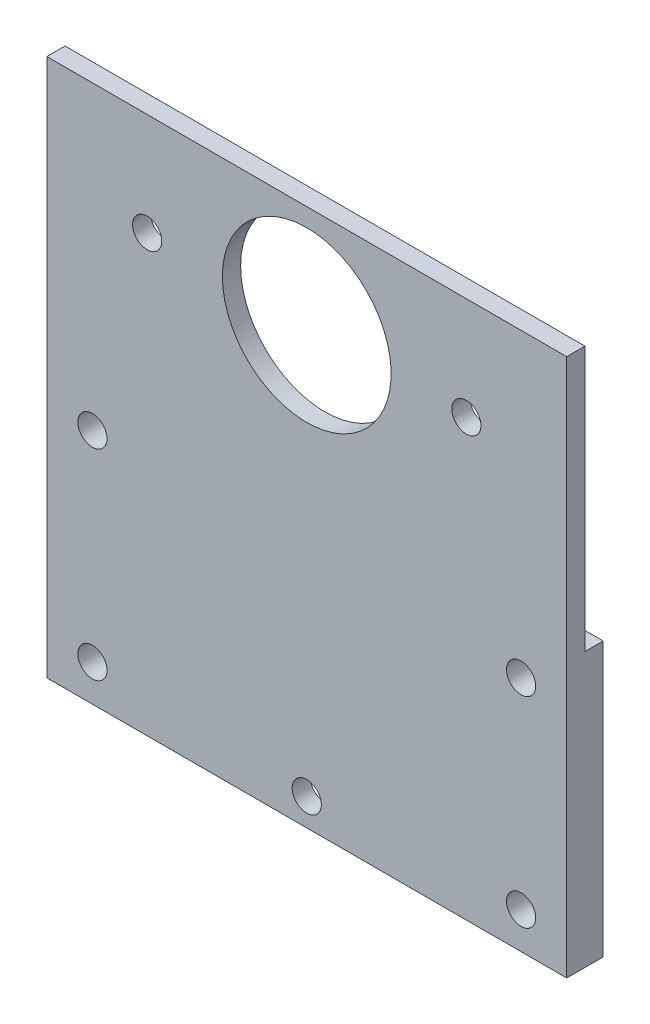
ISO-10303-21;
HEADER;
FILE_DESCRIPTION(('STEP AP214'),'2;1');
FILE_NAME('part.step','',(''),(''),'','','');
FILE_SCHEMA(('AUTOMOTIVE_DESIGN { 1 0 10303 214 1 1 1 1 }'));
ENDSEC;
DATA;
#1=APPLICATION_CONTEXT('core data for automotive mechanical design processes');
#2=APPLICATION_PROTOCOL_DEFINITION('international standard','automotive_design',2000,#1);
#3=PRODUCT_CONTEXT('',#1,'mechanical');
#4=PRODUCT('Part','Part','',(#3));
#5=PRODUCT_RELATED_PRODUCT_CATEGORY('part','',(#4));
#6=PRODUCT_DEFINITION_FORMATION('','',#4);
#7=PRODUCT_DEFINITION_CONTEXT('part definition',#1,'design');
#8=PRODUCT_DEFINITION('design','',#6,#7);
#9=PRODUCT_DEFINITION_SHAPE('','',#8);
#10=(LENGTH_UNIT() NAMED_UNIT(*) SI_UNIT(.MILLI.,.METRE.));
#11=(NAMED_UNIT(*) PLANE_ANGLE_UNIT() SI_UNIT($,.RADIAN.));
#12=(NAMED_UNIT(*) SI_UNIT($,.STERADIAN.) SOLID_ANGLE_UNIT());
#13=UNCERTAINTY_MEASURE_WITH_UNIT(LENGTH_MEASURE(1.E-05),#10,'distance_accuracy_value','');
#14=(GEOMETRIC_REPRESENTATION_CONTEXT(3) GLOBAL_UNCERTAINTY_ASSIGNED_CONTEXT((#13)) GLOBAL_UNIT_ASSIGNED_CONTEXT((#10,
#11,#12)) REPRESENTATION_CONTEXT('',''));
#15=CARTESIAN_POINT('',(0.,0.,0.));
#16=DIRECTION('',(0.,0.,1.));
#17=DIRECTION('',(1.,0.,0.));
#18=AXIS2_PLACEMENT_3D('',#15,#16,#17);
#19=CARTESIAN_POINT('',(0.,0.,0.));
#20=DIRECTION('',(0.,0.,-1.));
#21=DIRECTION('',(-1.,0.,0.));
#22=AXIS2_PLACEMENT_3D('',#19,#20,#21);
#23=PLANE('',#22);
#24=CARTESIAN_POINT('',(0.,3.,0.));
#25=DIRECTION('',(0.,0.,-1.));
#26=DIRECTION('',(-1.,0.,0.));
#27=AXIS2_PLACEMENT_3D('',#24,#25,#26);
#28=CIRCLE('',#27,1.6);
#29=CARTESIAN_POINT('',(-1.60000000000001,3.,0.));
#30=VERTEX_POINT('',#29);
#31=EDGE_CURVE('E253',#30,#30,#28,.T.);
#32=ORIENTED_EDGE('',*,*,#31,.F.);
#33=EDGE_LOOP('',(#32));
#34=FACE_BOUND('',#33,.T.);
#35=CARTESIAN_POINT('',(-17.5,47.75,0.));
#36=DIRECTION('',(0.,0.,-1.));
#37=DIRECTION('',(1.,0.,0.));
#38=AXIS2_PLACEMENT_3D('',#35,#36,#37);
#39=CIRCLE('',#38,1.6);
#40=CARTESIAN_POINT('',(-15.9,47.75,0.));
#41=VERTEX_POINT('',#40);
#42=EDGE_CURVE('E162',#41,#41,#39,.T.);
#43=ORIENTED_EDGE('',*,*,#42,.F.);
#44=EDGE_LOOP('',(#43));
#45=FACE_BOUND('',#44,.T.);
#46=CARTESIAN_POINT('',(17.5,47.75,0.));
#47=DIRECTION('',(0.,0.,-1.));
#48=DIRECTION('',(-1.,0.,0.));
#49=AXIS2_PLACEMENT_3D('',#46,#47,#48);
#50=CIRCLE('',#49,1.6);
#51=CARTESIAN_POINT('',(15.9,47.75,0.));
#52=VERTEX_POINT('',#51);
#53=EDGE_CURVE('E167',#52,#52,#50,.T.);
#54=ORIENTED_EDGE('',*,*,#53,.F.);
#55=EDGE_LOOP('',(#54));
#56=FACE_BOUND('',#55,.T.);
#57=CARTESIAN_POINT('',(0.,47.75,0.));
#58=DIRECTION('',(0.,0.,-1.));
#59=DIRECTION('',(-1.,0.,0.));
#60=AXIS2_PLACEMENT_3D('',#57,#58,#59);
#61=CIRCLE('',#60,9.25);
#62=CARTESIAN_POINT('',(-9.25,47.75,0.));
#63=VERTEX_POINT('',#62);
#64=EDGE_CURVE('E166',#63,#63,#61,.T.);
#65=ORIENTED_EDGE('',*,*,#64,.F.);
#66=EDGE_LOOP('',(#65));
#67=FACE_BOUND('',#66,.T.);
#68=DIRECTION('',(0.,-1.,0.));
#69=VECTOR('',#68,1.);
#70=CARTESIAN_POINT('',(-18.5,30.,0.));
#71=LINE('',#70,#69);
#72=CARTESIAN_POINT('',(-18.5,30.,0.));
#73=VERTEX_POINT('',#72);
#74=CARTESIAN_POINT('',(-18.5,0.,0.));
#75=VERTEX_POINT('',#74);
#76=EDGE_CURVE('E128',#73,#75,#71,.T.);
#77=ORIENTED_EDGE('',*,*,#76,.F.);
#78=DIRECTION('',(1.,0.,0.));
#79=VECTOR('',#78,1.);
#80=CARTESIAN_POINT('',(-28.5,30.,0.));
#81=LINE('',#80,#79);
#82=CARTESIAN_POINT('',(-28.5,30.,0.));
#83=VERTEX_POINT('',#82);
#84=EDGE_CURVE('E222',#83,#73,#81,.T.);
#85=ORIENTED_EDGE('',*,*,#84,.F.);
#86=DIRECTION('',(0.,-1.,0.));
#87=VECTOR('',#86,1.);
#88=CARTESIAN_POINT('',(-28.5,59.,0.));
#89=LINE('',#88,#87);
#90=CARTESIAN_POINT('',(-28.5,59.,0.));
#91=VERTEX_POINT('',#90);
#92=EDGE_CURVE('E133',#91,#83,#89,.T.);
#93=ORIENTED_EDGE('',*,*,#92,.F.);
#94=DIRECTION('',(-1.,0.,0.));
#95=VECTOR('',#94,1.);
#96=CARTESIAN_POINT('',(-28.5,59.,0.));
#97=LINE('',#96,#95);
#98=CARTESIAN_POINT('',(28.5,59.,0.));
#99=VERTEX_POINT('',#98);
#100=EDGE_CURVE('E184',#99,#91,#97,.T.);
#101=ORIENTED_EDGE('',*,*,#100,.F.);
#102=DIRECTION('',(0.,1.,0.));
#103=VECTOR('',#102,1.);
#104=CARTESIAN_POINT('',(28.5,59.,0.));
#105=LINE('',#104,#103);
#106=CARTESIAN_POINT('',(28.5,30.,0.));
#107=VERTEX_POINT('',#106);
#108=EDGE_CURVE('E193',#107,#99,#105,.T.);
#109=ORIENTED_EDGE('',*,*,#108,.F.);
#110=DIRECTION('',(1.,0.,0.));
#111=VECTOR('',#110,1.);
#112=CARTESIAN_POINT('',(28.5,30.,0.));
#113=LINE('',#112,#111);
#114=CARTESIAN_POINT('',(18.5,30.,0.));
#115=VERTEX_POINT('',#114);
#116=EDGE_CURVE('E137',#115,#107,#113,.T.);
#117=ORIENTED_EDGE('',*,*,#116,.F.);
#118=DIRECTION('',(0.,1.,0.));
#119=VECTOR('',#118,1.);
#120=CARTESIAN_POINT('',(18.5,30.,0.));
#121=LINE('',#120,#119);
#122=CARTESIAN_POINT('',(18.5,0.,0.));
#123=VERTEX_POINT('',#122);
#124=EDGE_CURVE('E134',#123,#115,#121,.T.);
#125=ORIENTED_EDGE('',*,*,#124,.F.);
#126=DIRECTION('',(1.,0.,0.));
#127=VECTOR('',#126,1.);
#128=CARTESIAN_POINT('',(28.5,0.,0.));
#129=LINE('',#128,#127);
#130=EDGE_CURVE('E53',#75,#123,#129,.T.);
#131=ORIENTED_EDGE('',*,*,#130,.F.);
#132=EDGE_LOOP('',(#77,#85,#93,#101,#109,#117,#125,#131));
#133=FACE_BOUND('',#132,.T.);
#134=ADVANCED_FACE('F33',(#34,#45,#56,#67,#133),#23,.T.);
#135=CARTESIAN_POINT('',(-28.5,59.,2.));
#136=DIRECTION('',(1.,0.,0.));
#137=DIRECTION('',(0.,1.,0.));
#138=AXIS2_PLACEMENT_3D('',#135,#136,#137);
#139=PLANE('',#138);
#140=ORIENTED_EDGE('',*,*,#92,.T.);
#141=DIRECTION('',(0.,0.,1.));
#142=VECTOR('',#141,1.);
#143=CARTESIAN_POINT('',(-28.5,30.,-2.));
#144=LINE('',#143,#142);
#145=CARTESIAN_POINT('',(-28.5,30.,-2.));
#146=VERTEX_POINT('',#145);
#147=EDGE_CURVE('E113',#146,#83,#144,.T.);
#148=ORIENTED_EDGE('',*,*,#147,.F.);
#149=DIRECTION('',(0.,1.,0.));
#150=VECTOR('',#149,1.);
#151=CARTESIAN_POINT('',(-28.5,30.,-2.));
#152=LINE('',#151,#150);
#153=CARTESIAN_POINT('',(-28.5,0.,-2.));
#154=VERTEX_POINT('',#153);
#155=EDGE_CURVE('E120',#154,#146,#152,.T.);
#156=ORIENTED_EDGE('',*,*,#155,.F.);
#157=DIRECTION('',(0.,0.,-1.));
#158=VECTOR('',#157,1.);
#159=CARTESIAN_POINT('',(-28.5,0.,2.));
#160=LINE('',#159,#158);
#161=CARTESIAN_POINT('',(-28.5,0.,2.));
#162=VERTEX_POINT('',#161);
#163=EDGE_CURVE('E11',#162,#154,#160,.T.);
#164=ORIENTED_EDGE('',*,*,#163,.F.);
#165=DIRECTION('',(0.,-1.,0.));
#166=VECTOR('',#165,1.);
#167=CARTESIAN_POINT('',(-28.5,59.,2.));
#168=LINE('',#167,#166);
#169=CARTESIAN_POINT('',(-28.5,59.,2.));
#170=VERTEX_POINT('',#169);
#171=EDGE_CURVE('E180',#170,#162,#168,.T.);
#172=ORIENTED_EDGE('',*,*,#171,.F.);
#173=DIRECTION('',(0.,0.,-1.));
#174=VECTOR('',#173,1.);
#175=CARTESIAN_POINT('',(-28.5,59.,2.));
#176=LINE('',#175,#174);
#177=EDGE_CURVE('E190',#170,#91,#176,.T.);
#178=ORIENTED_EDGE('',*,*,#177,.T.);
#179=EDGE_LOOP('',(#140,#148,#156,#164,#172,#178));
#180=FACE_BOUND('',#179,.T.);
#181=ADVANCED_FACE('F35',(#180),#139,.F.);
#182=CARTESIAN_POINT('',(28.5,0.,2.));
#183=DIRECTION('',(0.,1.,0.));
#184=DIRECTION('',(0.,0.,1.));
#185=AXIS2_PLACEMENT_3D('',#182,#183,#184);
#186=PLANE('',#185);
#187=ORIENTED_EDGE('',*,*,#163,.T.);
#188=DIRECTION('',(-1.,0.,0.));
#189=VECTOR('',#188,1.);
#190=CARTESIAN_POINT('',(-28.5,0.,-2.));
#191=LINE('',#190,#189);
#192=CARTESIAN_POINT('',(-18.5,0.,-2.));
#193=VERTEX_POINT('',#192);
#194=EDGE_CURVE('E125',#193,#154,#191,.T.);
#195=ORIENTED_EDGE('',*,*,#194,.F.);
#196=DIRECTION('',(0.,0.,1.));
#197=VECTOR('',#196,1.);
#198=CARTESIAN_POINT('',(-18.5,0.,-2.));
#199=LINE('',#198,#197);
#200=EDGE_CURVE('E48',#193,#75,#199,.T.);
#201=ORIENTED_EDGE('',*,*,#200,.T.);
#202=ORIENTED_EDGE('',*,*,#130,.T.);
#203=DIRECTION('',(0.,0.,1.));
#204=VECTOR('',#203,1.);
#205=CARTESIAN_POINT('',(18.5,0.,-2.));
#206=LINE('',#205,#204);
#207=CARTESIAN_POINT('',(18.5,0.,-2.));
#208=VERTEX_POINT('',#207);
#209=EDGE_CURVE('E159',#208,#123,#206,.T.);
#210=ORIENTED_EDGE('',*,*,#209,.F.);
#211=DIRECTION('',(-1.,0.,0.));
#212=VECTOR('',#211,1.);
#213=CARTESIAN_POINT('',(28.5,0.,-2.));
#214=LINE('',#213,#212);
#215=CARTESIAN_POINT('',(28.5,0.,-2.));
#216=VERTEX_POINT('',#215);
#217=EDGE_CURVE('E145',#216,#208,#214,.T.);
#218=ORIENTED_EDGE('',*,*,#217,.F.);
#219=DIRECTION('',(0.,0.,-1.));
#220=VECTOR('',#219,1.);
#221=CARTESIAN_POINT('',(28.5,0.,2.));
#222=LINE('',#221,#220);
#223=CARTESIAN_POINT('',(28.5,0.,2.));
#224=VERTEX_POINT('',#223);
#225=EDGE_CURVE('E41',#224,#216,#222,.T.);
#226=ORIENTED_EDGE('',*,*,#225,.F.);
#227=DIRECTION('',(1.,0.,0.));
#228=VECTOR('',#227,1.);
#229=CARTESIAN_POINT('',(28.5,0.,2.));
#230=LINE('',#229,#228);
#231=EDGE_CURVE('E183',#162,#224,#230,.T.);
#232=ORIENTED_EDGE('',*,*,#231,.F.);
#233=EDGE_LOOP('',(#187,#195,#201,#202,#210,#218,#226,#232));
#234=FACE_BOUND('',#233,.T.);
#235=ADVANCED_FACE('F206',(#234),#186,.F.);
#236=CARTESIAN_POINT('',(28.5,59.,2.));
#237=DIRECTION('',(-1.,0.,0.));
#238=DIRECTION('',(0.,-1.,0.));
#239=AXIS2_PLACEMENT_3D('',#236,#237,#238);
#240=PLANE('',#239);
#241=ORIENTED_EDGE('',*,*,#225,.T.);
#242=DIRECTION('',(0.,-1.,0.));
#243=VECTOR('',#242,1.);
#244=CARTESIAN_POINT('',(28.5,30.,-2.));
#245=LINE('',#244,#243);
#246=CARTESIAN_POINT('',(28.5,30.,-2.));
#247=VERTEX_POINT('',#246);
#248=EDGE_CURVE('E142',#247,#216,#245,.T.);
#249=ORIENTED_EDGE('',*,*,#248,.F.);
#250=DIRECTION('',(0.,0.,1.));
#251=VECTOR('',#250,1.);
#252=CARTESIAN_POINT('',(28.5,30.,-2.));
#253=LINE('',#252,#251);
#254=EDGE_CURVE('E150',#247,#107,#253,.T.);
#255=ORIENTED_EDGE('',*,*,#254,.T.);
#256=ORIENTED_EDGE('',*,*,#108,.T.);
#257=DIRECTION('',(0.,0.,-1.));
#258=VECTOR('',#257,1.);
#259=CARTESIAN_POINT('',(28.5,59.,2.));
#260=LINE('',#259,#258);
#261=CARTESIAN_POINT('',(28.5,59.,2.));
#262=VERTEX_POINT('',#261);
#263=EDGE_CURVE('E197',#262,#99,#260,.T.);
#264=ORIENTED_EDGE('',*,*,#263,.F.);
#265=DIRECTION('',(0.,1.,0.));
#266=VECTOR('',#265,1.);
#267=CARTESIAN_POINT('',(28.5,59.,2.));
#268=LINE('',#267,#266);
#269=EDGE_CURVE('E186',#224,#262,#268,.T.);
#270=ORIENTED_EDGE('',*,*,#269,.F.);
#271=EDGE_LOOP('',(#241,#249,#255,#256,#264,#270));
#272=FACE_BOUND('',#271,.T.);
#273=ADVANCED_FACE('F204',(#272),#240,.F.);
#274=CARTESIAN_POINT('',(-28.5,59.,2.));
#275=DIRECTION('',(0.,-1.,0.));
#276=DIRECTION('',(0.,0.,-1.));
#277=AXIS2_PLACEMENT_3D('',#274,#275,#276);
#278=PLANE('',#277);
#279=ORIENTED_EDGE('',*,*,#100,.T.);
#280=ORIENTED_EDGE('',*,*,#177,.F.);
#281=DIRECTION('',(-1.,0.,0.));
#282=VECTOR('',#281,1.);
#283=CARTESIAN_POINT('',(-28.5,59.,2.));
#284=LINE('',#283,#282);
#285=EDGE_CURVE('E188',#262,#170,#284,.T.);
#286=ORIENTED_EDGE('',*,*,#285,.F.);
#287=ORIENTED_EDGE('',*,*,#263,.T.);
#288=EDGE_LOOP('',(#279,#280,#286,#287));
#289=FACE_BOUND('',#288,.T.);
#290=ADVANCED_FACE('F219',(#289),#278,.F.);
#291=CARTESIAN_POINT('',(0.,0.,2.));
#292=DIRECTION('',(0.,0.,-1.));
#293=DIRECTION('',(-1.,0.,0.));
#294=AXIS2_PLACEMENT_3D('',#291,#292,#293);
#295=PLANE('',#294);
#296=CARTESIAN_POINT('',(0.,3.,2.));
#297=DIRECTION('',(0.,0.,-1.));
#298=DIRECTION('',(-1.,0.,0.));
#299=AXIS2_PLACEMENT_3D('',#296,#297,#298);
#300=CIRCLE('',#299,1.6);
#301=CARTESIAN_POINT('',(-1.60000000000001,3.,2.));
#302=VERTEX_POINT('',#301);
#303=EDGE_CURVE('E239',#302,#302,#300,.T.);
#304=ORIENTED_EDGE('',*,*,#303,.T.);
#305=EDGE_LOOP('',(#304));
#306=FACE_BOUND('',#305,.T.);
#307=CARTESIAN_POINT('',(23.5,4.,2.));
#308=DIRECTION('',(0.,0.,-1.));
#309=DIRECTION('',(1.,0.,0.));
#310=AXIS2_PLACEMENT_3D('',#307,#308,#309);
#311=CIRCLE('',#310,1.6);
#312=CARTESIAN_POINT('',(25.1,4.,2.));
#313=VERTEX_POINT('',#312);
#314=EDGE_CURVE('E238',#313,#313,#311,.T.);
#315=ORIENTED_EDGE('',*,*,#314,.T.);
#316=EDGE_LOOP('',(#315));
#317=FACE_BOUND('',#316,.T.);
#318=CARTESIAN_POINT('',(-23.5,4.00000000000001,2.));
#319=DIRECTION('',(0.,0.,-1.));
#320=DIRECTION('',(-1.,0.,0.));
#321=AXIS2_PLACEMENT_3D('',#318,#319,#320);
#322=CIRCLE('',#321,1.6);
#323=CARTESIAN_POINT('',(-25.1,4.00000000000001,2.));
#324=VERTEX_POINT('',#323);
#325=EDGE_CURVE('E245',#324,#324,#322,.T.);
#326=ORIENTED_EDGE('',*,*,#325,.T.);
#327=EDGE_LOOP('',(#326));
#328=FACE_BOUND('',#327,.T.);
#329=CARTESIAN_POINT('',(-23.5,26.,2.));
#330=DIRECTION('',(0.,0.,-1.));
#331=DIRECTION('',(1.,0.,0.));
#332=AXIS2_PLACEMENT_3D('',#329,#330,#331);
#333=CIRCLE('',#332,1.6);
#334=CARTESIAN_POINT('',(-21.9,26.,2.));
#335=VERTEX_POINT('',#334);
#336=EDGE_CURVE('E233',#335,#335,#333,.T.);
#337=ORIENTED_EDGE('',*,*,#336,.T.);
#338=EDGE_LOOP('',(#337));
#339=FACE_BOUND('',#338,.T.);
#340=CARTESIAN_POINT('',(23.5,26.,2.));
#341=DIRECTION('',(0.,0.,-1.));
#342=DIRECTION('',(-1.,0.,0.));
#343=AXIS2_PLACEMENT_3D('',#340,#341,#342);
#344=CIRCLE('',#343,1.6);
#345=CARTESIAN_POINT('',(21.9,26.,2.));
#346=VERTEX_POINT('',#345);
#347=EDGE_CURVE('E223',#346,#346,#344,.T.);
#348=ORIENTED_EDGE('',*,*,#347,.T.);
#349=EDGE_LOOP('',(#348));
#350=FACE_BOUND('',#349,.T.);
#351=CARTESIAN_POINT('',(-17.5,47.75,2.));
#352=DIRECTION('',(0.,0.,-1.));
#353=DIRECTION('',(1.,0.,0.));
#354=AXIS2_PLACEMENT_3D('',#351,#352,#353);
#355=CIRCLE('',#354,1.6);
#356=CARTESIAN_POINT('',(-15.9,47.75,2.));
#357=VERTEX_POINT('',#356);
#358=EDGE_CURVE('E170',#357,#357,#355,.T.);
#359=ORIENTED_EDGE('',*,*,#358,.T.);
#360=EDGE_LOOP('',(#359));
#361=FACE_BOUND('',#360,.T.);
#362=CARTESIAN_POINT('',(17.5,47.75,2.));
#363=DIRECTION('',(0.,0.,-1.));
#364=DIRECTION('',(-1.,0.,0.));
#365=AXIS2_PLACEMENT_3D('',#362,#363,#364);
#366=CIRCLE('',#365,1.6);
#367=CARTESIAN_POINT('',(15.9,47.75,2.));
#368=VERTEX_POINT('',#367);
#369=EDGE_CURVE('E163',#368,#368,#366,.T.);
#370=ORIENTED_EDGE('',*,*,#369,.T.);
#371=EDGE_LOOP('',(#370));
#372=FACE_BOUND('',#371,.T.);
#373=CARTESIAN_POINT('',(0.,47.75,2.));
#374=DIRECTION('',(0.,0.,-1.));
#375=DIRECTION('',(-1.,0.,0.));
#376=AXIS2_PLACEMENT_3D('',#373,#374,#375);
#377=CIRCLE('',#376,9.25);
#378=CARTESIAN_POINT('',(-9.25,47.75,2.));
#379=VERTEX_POINT('',#378);
#380=EDGE_CURVE('E175',#379,#379,#377,.T.);
#381=ORIENTED_EDGE('',*,*,#380,.T.);
#382=EDGE_LOOP('',(#381));
#383=FACE_BOUND('',#382,.T.);
#384=ORIENTED_EDGE('',*,*,#171,.T.);
#385=ORIENTED_EDGE('',*,*,#231,.T.);
#386=ORIENTED_EDGE('',*,*,#269,.T.);
#387=ORIENTED_EDGE('',*,*,#285,.T.);
#388=EDGE_LOOP('',(#384,#385,#386,#387));
#389=FACE_BOUND('',#388,.T.);
#390=ADVANCED_FACE('F259',(#306,#317,#328,#339,#350,#361,#372,#383,#389),#295,.F.);
#391=CARTESIAN_POINT('',(0.,47.75,2.));
#392=DIRECTION('',(0.,0.,-1.));
#393=DIRECTION('',(-1.,0.,0.));
#394=AXIS2_PLACEMENT_3D('',#391,#392,#393);
#395=CYLINDRICAL_SURFACE('',#394,9.25);
#396=ORIENTED_EDGE('',*,*,#380,.F.);
#397=EDGE_LOOP('',(#396));
#398=FACE_BOUND('',#397,.T.);
#399=ORIENTED_EDGE('',*,*,#64,.T.);
#400=EDGE_LOOP('',(#399));
#401=FACE_BOUND('',#400,.T.);
#402=ADVANCED_FACE('F278',(#398,#401),#395,.F.);
#403=CARTESIAN_POINT('',(17.5,47.75,2.));
#404=DIRECTION('',(0.,0.,-1.));
#405=DIRECTION('',(-1.,0.,0.));
#406=AXIS2_PLACEMENT_3D('',#403,#404,#405);
#407=CYLINDRICAL_SURFACE('',#406,1.6);
#408=ORIENTED_EDGE('',*,*,#369,.F.);
#409=EDGE_LOOP('',(#408));
#410=FACE_BOUND('',#409,.T.);
#411=ORIENTED_EDGE('',*,*,#53,.T.);
#412=EDGE_LOOP('',(#411));
#413=FACE_BOUND('',#412,.T.);
#414=ADVANCED_FACE('F280',(#410,#413),#407,.F.);
#415=CARTESIAN_POINT('',(-17.5,47.75,2.));
#416=DIRECTION('',(0.,0.,-1.));
#417=DIRECTION('',(-1.,0.,0.));
#418=AXIS2_PLACEMENT_3D('',#415,#416,#417);
#419=CYLINDRICAL_SURFACE('',#418,1.6);
#420=ORIENTED_EDGE('',*,*,#358,.F.);
#421=EDGE_LOOP('',(#420));
#422=FACE_BOUND('',#421,.T.);
#423=ORIENTED_EDGE('',*,*,#42,.T.);
#424=EDGE_LOOP('',(#423));
#425=FACE_BOUND('',#424,.T.);
#426=ADVANCED_FACE('F287',(#422,#425),#419,.F.);
#427=CARTESIAN_POINT('',(18.5,30.,-2.));
#428=DIRECTION('',(1.,0.,0.));
#429=DIRECTION('',(0.,1.,0.));
#430=AXIS2_PLACEMENT_3D('',#427,#428,#429);
#431=PLANE('',#430);
#432=ORIENTED_EDGE('',*,*,#124,.T.);
#433=DIRECTION('',(0.,0.,1.));
#434=VECTOR('',#433,1.);
#435=CARTESIAN_POINT('',(18.5,30.,-2.));
#436=LINE('',#435,#434);
#437=CARTESIAN_POINT('',(18.5,30.,-2.));
#438=VERTEX_POINT('',#437);
#439=EDGE_CURVE('E156',#438,#115,#436,.T.);
#440=ORIENTED_EDGE('',*,*,#439,.F.);
#441=DIRECTION('',(0.,1.,0.));
#442=VECTOR('',#441,1.);
#443=CARTESIAN_POINT('',(18.5,30.,-2.));
#444=LINE('',#443,#442);
#445=EDGE_CURVE('E147',#208,#438,#444,.T.);
#446=ORIENTED_EDGE('',*,*,#445,.F.);
#447=ORIENTED_EDGE('',*,*,#209,.T.);
#448=EDGE_LOOP('',(#432,#440,#446,#447));
#449=FACE_BOUND('',#448,.T.);
#450=ADVANCED_FACE('F390',(#449),#431,.F.);
#451=CARTESIAN_POINT('',(28.5,30.,-2.));
#452=DIRECTION('',(0.,-1.,0.));
#453=DIRECTION('',(0.,0.,-1.));
#454=AXIS2_PLACEMENT_3D('',#451,#452,#453);
#455=PLANE('',#454);
#456=ORIENTED_EDGE('',*,*,#116,.T.);
#457=ORIENTED_EDGE('',*,*,#254,.F.);
#458=DIRECTION('',(1.,0.,0.));
#459=VECTOR('',#458,1.);
#460=CARTESIAN_POINT('',(28.5,30.,-2.));
#461=LINE('',#460,#459);
#462=EDGE_CURVE('E149',#438,#247,#461,.T.);
#463=ORIENTED_EDGE('',*,*,#462,.F.);
#464=ORIENTED_EDGE('',*,*,#439,.T.);
#465=EDGE_LOOP('',(#456,#457,#463,#464));
#466=FACE_BOUND('',#465,.T.);
#467=ADVANCED_FACE('F214',(#466),#455,.F.);
#468=CARTESIAN_POINT('',(0.,0.,-2.));
#469=DIRECTION('',(0.,0.,-1.));
#470=DIRECTION('',(-1.,0.,0.));
#471=AXIS2_PLACEMENT_3D('',#468,#469,#470);
#472=PLANE('',#471);
#473=CARTESIAN_POINT('',(23.5,4.,-2.));
#474=DIRECTION('',(0.,0.,-1.));
#475=DIRECTION('',(1.,0.,0.));
#476=AXIS2_PLACEMENT_3D('',#473,#474,#475);
#477=CIRCLE('',#476,1.6);
#478=CARTESIAN_POINT('',(25.1,4.,-2.));
#479=VERTEX_POINT('',#478);
#480=EDGE_CURVE('E235',#479,#479,#477,.T.);
#481=ORIENTED_EDGE('',*,*,#480,.F.);
#482=EDGE_LOOP('',(#481));
#483=FACE_BOUND('',#482,.T.);
#484=CARTESIAN_POINT('',(23.5,26.,-2.));
#485=DIRECTION('',(0.,0.,-1.));
#486=DIRECTION('',(-1.,0.,0.));
#487=AXIS2_PLACEMENT_3D('',#484,#485,#486);
#488=CIRCLE('',#487,1.6);
#489=CARTESIAN_POINT('',(21.9,26.,-2.));
#490=VERTEX_POINT('',#489);
#491=EDGE_CURVE('E227',#490,#490,#488,.T.);
#492=ORIENTED_EDGE('',*,*,#491,.F.);
#493=EDGE_LOOP('',(#492));
#494=FACE_BOUND('',#493,.T.);
#495=ORIENTED_EDGE('',*,*,#248,.T.);
#496=ORIENTED_EDGE('',*,*,#217,.T.);
#497=ORIENTED_EDGE('',*,*,#445,.T.);
#498=ORIENTED_EDGE('',*,*,#462,.T.);
#499=EDGE_LOOP('',(#495,#496,#497,#498));
#500=FACE_BOUND('',#499,.T.);
#501=ADVANCED_FACE('F209',(#483,#494,#500),#472,.T.);
#502=CARTESIAN_POINT('',(-28.5,30.,-2.));
#503=DIRECTION('',(0.,-1.,0.));
#504=DIRECTION('',(0.,0.,-1.));
#505=AXIS2_PLACEMENT_3D('',#502,#503,#504);
#506=PLANE('',#505);
#507=ORIENTED_EDGE('',*,*,#84,.T.);
#508=DIRECTION('',(0.,0.,1.));
#509=VECTOR('',#508,1.);
#510=CARTESIAN_POINT('',(-18.5,30.,-2.));
#511=LINE('',#510,#509);
#512=CARTESIAN_POINT('',(-18.5,30.,-2.));
#513=VERTEX_POINT('',#512);
#514=EDGE_CURVE('E116',#513,#73,#511,.T.);
#515=ORIENTED_EDGE('',*,*,#514,.F.);
#516=DIRECTION('',(1.,0.,0.));
#517=VECTOR('',#516,1.);
#518=CARTESIAN_POINT('',(-28.5,30.,-2.));
#519=LINE('',#518,#517);
#520=EDGE_CURVE('E109',#146,#513,#519,.T.);
#521=ORIENTED_EDGE('',*,*,#520,.F.);
#522=ORIENTED_EDGE('',*,*,#147,.T.);
#523=EDGE_LOOP('',(#507,#515,#521,#522));
#524=FACE_BOUND('',#523,.T.);
#525=ADVANCED_FACE('F111',(#524),#506,.F.);
#526=CARTESIAN_POINT('',(-18.5,30.,-2.));
#527=DIRECTION('',(-1.,0.,0.));
#528=DIRECTION('',(0.,-1.,0.));
#529=AXIS2_PLACEMENT_3D('',#526,#527,#528);
#530=PLANE('',#529);
#531=ORIENTED_EDGE('',*,*,#76,.T.);
#532=ORIENTED_EDGE('',*,*,#200,.F.);
#533=DIRECTION('',(0.,-1.,0.));
#534=VECTOR('',#533,1.);
#535=CARTESIAN_POINT('',(-18.5,30.,-2.));
#536=LINE('',#535,#534);
#537=EDGE_CURVE('E119',#513,#193,#536,.T.);
#538=ORIENTED_EDGE('',*,*,#537,.F.);
#539=ORIENTED_EDGE('',*,*,#514,.T.);
#540=EDGE_LOOP('',(#531,#532,#538,#539));
#541=FACE_BOUND('',#540,.T.);
#542=ADVANCED_FACE('F362',(#541),#530,.F.);
#543=CARTESIAN_POINT('',(0.,0.,-2.));
#544=DIRECTION('',(0.,0.,1.));
#545=DIRECTION('',(1.,0.,0.));
#546=AXIS2_PLACEMENT_3D('',#543,#544,#545);
#547=PLANE('',#546);
#548=CARTESIAN_POINT('',(-23.5,4.00000000000001,-2.));
#549=DIRECTION('',(0.,0.,-1.));
#550=DIRECTION('',(-1.,0.,0.));
#551=AXIS2_PLACEMENT_3D('',#548,#549,#550);
#552=CIRCLE('',#551,1.6);
#553=CARTESIAN_POINT('',(-25.1,4.00000000000001,-2.));
#554=VERTEX_POINT('',#553);
#555=EDGE_CURVE('E242',#554,#554,#552,.T.);
#556=ORIENTED_EDGE('',*,*,#555,.F.);
#557=EDGE_LOOP('',(#556));
#558=FACE_BOUND('',#557,.T.);
#559=CARTESIAN_POINT('',(-23.5,26.,-2.));
#560=DIRECTION('',(0.,0.,-1.));
#561=DIRECTION('',(1.,0.,0.));
#562=AXIS2_PLACEMENT_3D('',#559,#560,#561);
#563=CIRCLE('',#562,1.6);
#564=CARTESIAN_POINT('',(-21.9,26.,-2.));
#565=VERTEX_POINT('',#564);
#566=EDGE_CURVE('E248',#565,#565,#563,.T.);
#567=ORIENTED_EDGE('',*,*,#566,.F.);
#568=EDGE_LOOP('',(#567));
#569=FACE_BOUND('',#568,.T.);
#570=ORIENTED_EDGE('',*,*,#155,.T.);
#571=ORIENTED_EDGE('',*,*,#520,.T.);
#572=ORIENTED_EDGE('',*,*,#537,.T.);
#573=ORIENTED_EDGE('',*,*,#194,.T.);
#574=EDGE_LOOP('',(#570,#571,#572,#573));
#575=FACE_BOUND('',#574,.T.);
#576=ADVANCED_FACE('F124',(#558,#569,#575),#547,.F.);
#577=CARTESIAN_POINT('',(-23.5,26.,2.));
#578=DIRECTION('',(0.,0.,-1.));
#579=DIRECTION('',(-1.,0.,0.));
#580=AXIS2_PLACEMENT_3D('',#577,#578,#579);
#581=CYLINDRICAL_SURFACE('',#580,1.6);
#582=ORIENTED_EDGE('',*,*,#336,.F.);
#583=EDGE_LOOP('',(#582));
#584=FACE_BOUND('',#583,.T.);
#585=ORIENTED_EDGE('',*,*,#566,.T.);
#586=EDGE_LOOP('',(#585));
#587=FACE_BOUND('',#586,.T.);
#588=ADVANCED_FACE('F347',(#584,#587),#581,.F.);
#589=CARTESIAN_POINT('',(-23.5,4.00000000000001,2.));
#590=DIRECTION('',(0.,0.,-1.));
#591=DIRECTION('',(-1.,0.,0.));
#592=AXIS2_PLACEMENT_3D('',#589,#590,#591);
#593=CYLINDRICAL_SURFACE('',#592,1.6);
#594=ORIENTED_EDGE('',*,*,#325,.F.);
#595=EDGE_LOOP('',(#594));
#596=FACE_BOUND('',#595,.T.);
#597=ORIENTED_EDGE('',*,*,#555,.T.);
#598=EDGE_LOOP('',(#597));
#599=FACE_BOUND('',#598,.T.);
#600=ADVANCED_FACE('F339',(#596,#599),#593,.F.);
#601=CARTESIAN_POINT('',(23.5,26.,2.));
#602=DIRECTION('',(0.,0.,-1.));
#603=DIRECTION('',(-1.,0.,0.));
#604=AXIS2_PLACEMENT_3D('',#601,#602,#603);
#605=CYLINDRICAL_SURFACE('',#604,1.6);
#606=ORIENTED_EDGE('',*,*,#347,.F.);
#607=EDGE_LOOP('',(#606));
#608=FACE_BOUND('',#607,.T.);
#609=ORIENTED_EDGE('',*,*,#491,.T.);
#610=EDGE_LOOP('',(#609));
#611=FACE_BOUND('',#610,.T.);
#612=ADVANCED_FACE('F334',(#608,#611),#605,.F.);
#613=CARTESIAN_POINT('',(23.5,4.,2.));
#614=DIRECTION('',(0.,0.,-1.));
#615=DIRECTION('',(-1.,0.,0.));
#616=AXIS2_PLACEMENT_3D('',#613,#614,#615);
#617=CYLINDRICAL_SURFACE('',#616,1.6);
#618=ORIENTED_EDGE('',*,*,#314,.F.);
#619=EDGE_LOOP('',(#618));
#620=FACE_BOUND('',#619,.T.);
#621=ORIENTED_EDGE('',*,*,#480,.T.);
#622=EDGE_LOOP('',(#621));
#623=FACE_BOUND('',#622,.T.);
#624=ADVANCED_FACE('F265',(#620,#623),#617,.F.);
#625=CARTESIAN_POINT('',(0.,3.,2.));
#626=DIRECTION('',(0.,0.,-1.));
#627=DIRECTION('',(-1.,0.,0.));
#628=AXIS2_PLACEMENT_3D('',#625,#626,#627);
#629=CYLINDRICAL_SURFACE('',#628,1.6);
#630=ORIENTED_EDGE('',*,*,#303,.F.);
#631=EDGE_LOOP('',(#630));
#632=FACE_BOUND('',#631,.T.);
#633=ORIENTED_EDGE('',*,*,#31,.T.);
#634=EDGE_LOOP('',(#633));
#635=FACE_BOUND('',#634,.T.);
#636=ADVANCED_FACE('F262',(#632,#635),#629,.F.);
#637=CLOSED_SHELL('',(#134,#181,#235,#273,#290,#390,#402,#414,#426,#450,#467,#501,#525,#542,
#576,#588,#600,#612,#624,#636));
#638=MANIFOLD_SOLID_BREP('B2',#637);
#639=ADVANCED_BREP_SHAPE_REPRESENTATION('',(#18,#638),#14);
#640=SHAPE_DEFINITION_REPRESENTATION(#9,#639);
ENDSEC;
END-ISO-10303-21;
